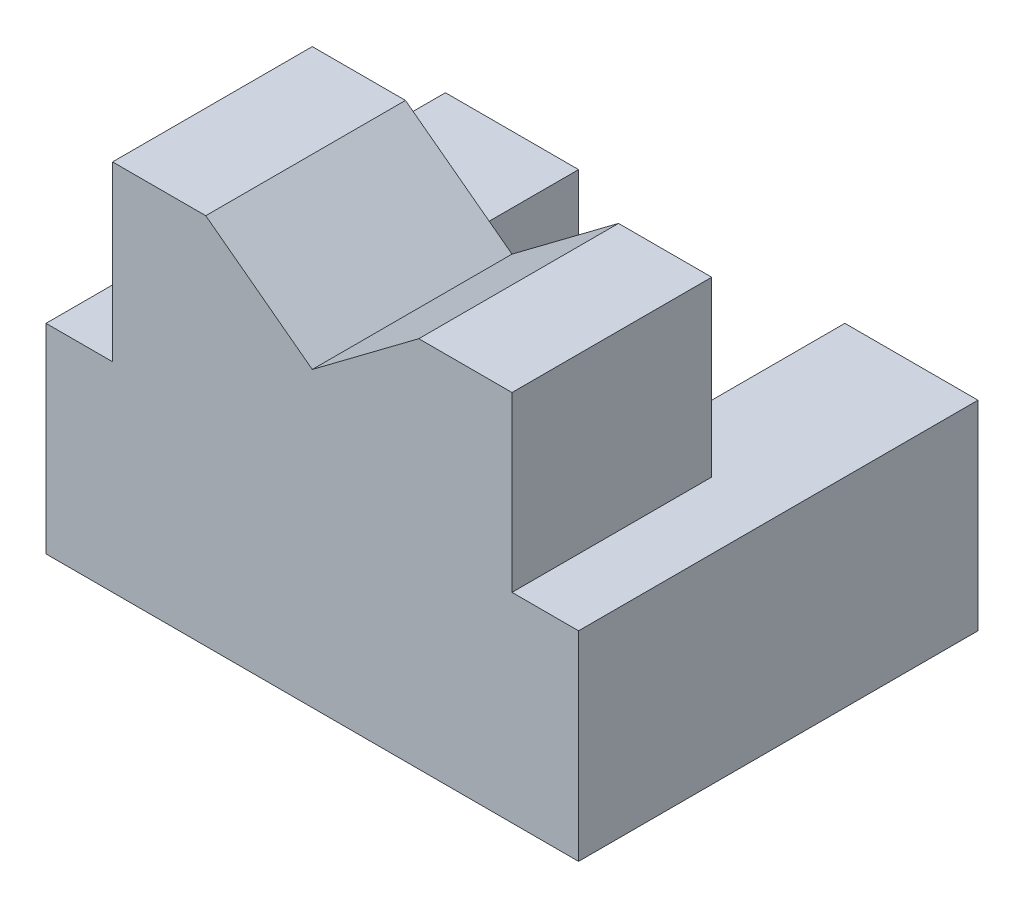
ISO-10303-21;
HEADER;
FILE_DESCRIPTION(('STEP AP214'),'2;1');
FILE_NAME('part.step','',(''),(''),'','','');
FILE_SCHEMA(('AUTOMOTIVE_DESIGN { 1 0 10303 214 1 1 1 1 }'));
ENDSEC;
DATA;
#1=APPLICATION_CONTEXT('core data for automotive mechanical design processes');
#2=APPLICATION_PROTOCOL_DEFINITION('international standard','automotive_design',2000,#1);
#3=PRODUCT_CONTEXT('',#1,'mechanical');
#4=PRODUCT('Part','Part','',(#3));
#5=PRODUCT_RELATED_PRODUCT_CATEGORY('part','',(#4));
#6=PRODUCT_DEFINITION_FORMATION('','',#4);
#7=PRODUCT_DEFINITION_CONTEXT('part definition',#1,'design');
#8=PRODUCT_DEFINITION('design','',#6,#7);
#9=PRODUCT_DEFINITION_SHAPE('','',#8);
#10=(LENGTH_UNIT() NAMED_UNIT(*) SI_UNIT(.MILLI.,.METRE.));
#11=(NAMED_UNIT(*) PLANE_ANGLE_UNIT() SI_UNIT($,.RADIAN.));
#12=(NAMED_UNIT(*) SI_UNIT($,.STERADIAN.) SOLID_ANGLE_UNIT());
#13=UNCERTAINTY_MEASURE_WITH_UNIT(LENGTH_MEASURE(1.E-05),#10,'distance_accuracy_value','');
#14=(GEOMETRIC_REPRESENTATION_CONTEXT(3) GLOBAL_UNCERTAINTY_ASSIGNED_CONTEXT((#13)) GLOBAL_UNIT_ASSIGNED_CONTEXT((#10,
#11,#12)) REPRESENTATION_CONTEXT('',''));
#15=CARTESIAN_POINT('',(0.,0.,0.));
#16=DIRECTION('',(0.,0.,1.));
#17=DIRECTION('',(1.,0.,0.));
#18=AXIS2_PLACEMENT_3D('',#15,#16,#17);
#19=CARTESIAN_POINT('',(0.,0.,-15.));
#20=DIRECTION('',(0.,0.,1.));
#21=DIRECTION('',(1.,0.,0.));
#22=AXIS2_PLACEMENT_3D('',#19,#20,#21);
#23=PLANE('',#22);
#24=DIRECTION('',(1.,0.,0.));
#25=VECTOR('',#24,1.);
#26=CARTESIAN_POINT('',(0.,-13.,-15.));
#27=LINE('',#26,#25);
#28=CARTESIAN_POINT('',(25.,-13.,-15.));
#29=VERTEX_POINT('',#28);
#30=CARTESIAN_POINT('',(30.,-13.,-15.));
#31=VERTEX_POINT('',#30);
#32=EDGE_CURVE('E59',#29,#31,#27,.T.);
#33=ORIENTED_EDGE('',*,*,#32,.F.);
#34=DIRECTION('',(0.,1.,0.));
#35=VECTOR('',#34,1.);
#36=CARTESIAN_POINT('',(25.,0.,-15.));
#37=LINE('',#36,#35);
#38=CARTESIAN_POINT('',(25.,-28.,-15.));
#39=VERTEX_POINT('',#38);
#40=EDGE_CURVE('E166',#39,#29,#37,.T.);
#41=ORIENTED_EDGE('',*,*,#40,.F.);
#42=DIRECTION('',(1.,0.,0.));
#43=VECTOR('',#42,1.);
#44=CARTESIAN_POINT('',(0.,-28.,-15.));
#45=LINE('',#44,#43);
#46=CARTESIAN_POINT('',(5.,-28.,-15.));
#47=VERTEX_POINT('',#46);
#48=EDGE_CURVE('E277',#47,#39,#45,.T.);
#49=ORIENTED_EDGE('',*,*,#48,.F.);
#50=DIRECTION('',(0.,1.,0.));
#51=VECTOR('',#50,1.);
#52=CARTESIAN_POINT('',(5.,0.,-15.));
#53=LINE('',#52,#51);
#54=CARTESIAN_POINT('',(5.,-13.,-15.));
#55=VERTEX_POINT('',#54);
#56=EDGE_CURVE('E228',#47,#55,#53,.T.);
#57=ORIENTED_EDGE('',*,*,#56,.T.);
#58=DIRECTION('',(-1.,0.,0.));
#59=VECTOR('',#58,1.);
#60=CARTESIAN_POINT('',(0.,-13.,-15.));
#61=LINE('',#60,#59);
#62=CARTESIAN_POINT('',(0.,-13.,-15.));
#63=VERTEX_POINT('',#62);
#64=EDGE_CURVE('E243',#55,#63,#61,.T.);
#65=ORIENTED_EDGE('',*,*,#64,.T.);
#66=DIRECTION('',(0.,-1.,0.));
#67=VECTOR('',#66,1.);
#68=CARTESIAN_POINT('',(0.,0.,-15.));
#69=LINE('',#68,#67);
#70=CARTESIAN_POINT('',(0.,0.,-15.));
#71=VERTEX_POINT('',#70);
#72=EDGE_CURVE('E273',#71,#63,#69,.T.);
#73=ORIENTED_EDGE('',*,*,#72,.F.);
#74=DIRECTION('',(1.,0.,0.));
#75=VECTOR('',#74,1.);
#76=CARTESIAN_POINT('',(0.,0.,-15.));
#77=LINE('',#76,#75);
#78=CARTESIAN_POINT('',(7.,0.,-15.));
#79=VERTEX_POINT('',#78);
#80=EDGE_CURVE('E286',#71,#79,#77,.T.);
#81=ORIENTED_EDGE('',*,*,#80,.T.);
#82=DIRECTION('',(-0.8,0.6,0.));
#83=VECTOR('',#82,1.);
#84=CARTESIAN_POINT('',(15.,-6.,-15.));
#85=LINE('',#84,#83);
#86=CARTESIAN_POINT('',(15.,-6.,-15.));
#87=VERTEX_POINT('',#86);
#88=EDGE_CURVE('E248',#87,#79,#85,.T.);
#89=ORIENTED_EDGE('',*,*,#88,.F.);
#90=DIRECTION('',(-0.8,-0.6,0.));
#91=VECTOR('',#90,1.);
#92=CARTESIAN_POINT('',(23.,0.,-15.));
#93=LINE('',#92,#91);
#94=CARTESIAN_POINT('',(23.,0.,-15.));
#95=VERTEX_POINT('',#94);
#96=EDGE_CURVE('E251',#95,#87,#93,.T.);
#97=ORIENTED_EDGE('',*,*,#96,.F.);
#98=CARTESIAN_POINT('',(30.,0.,-15.));
#99=VERTEX_POINT('',#98);
#100=EDGE_CURVE('E285',#95,#99,#77,.T.);
#101=ORIENTED_EDGE('',*,*,#100,.T.);
#102=DIRECTION('',(0.,-1.,0.));
#103=VECTOR('',#102,1.);
#104=CARTESIAN_POINT('',(30.,0.,-15.));
#105=LINE('',#104,#103);
#106=EDGE_CURVE('E282',#99,#31,#105,.T.);
#107=ORIENTED_EDGE('',*,*,#106,.T.);
#108=EDGE_LOOP('',(#33,#41,#49,#57,#65,#73,#81,#89,#97,#101,#107));
#109=FACE_BOUND('',#108,.T.);
#110=ADVANCED_FACE('F43',(#109),#23,.F.);
#111=CARTESIAN_POINT('',(30.,0.,-15.));
#112=DIRECTION('',(-1.,0.,0.));
#113=DIRECTION('',(0.,-1.,0.));
#114=AXIS2_PLACEMENT_3D('',#111,#112,#113);
#115=PLANE('',#114);
#116=DIRECTION('',(0.,0.,1.));
#117=VECTOR('',#116,1.);
#118=CARTESIAN_POINT('',(30.,-13.,-15.));
#119=LINE('',#118,#117);
#120=CARTESIAN_POINT('',(30.,-13.,0.));
#121=VERTEX_POINT('',#120);
#122=EDGE_CURVE('E11',#31,#121,#119,.T.);
#123=ORIENTED_EDGE('',*,*,#122,.F.);
#124=ORIENTED_EDGE('',*,*,#106,.F.);
#125=DIRECTION('',(0.,0.,1.));
#126=VECTOR('',#125,1.);
#127=CARTESIAN_POINT('',(30.,0.,-15.));
#128=LINE('',#127,#126);
#129=CARTESIAN_POINT('',(30.,0.,0.));
#130=VERTEX_POINT('',#129);
#131=EDGE_CURVE('E290',#99,#130,#128,.T.);
#132=ORIENTED_EDGE('',*,*,#131,.T.);
#133=DIRECTION('',(0.,-1.,0.));
#134=VECTOR('',#133,1.);
#135=CARTESIAN_POINT('',(30.,0.,0.));
#136=LINE('',#135,#134);
#137=EDGE_CURVE('E297',#130,#121,#136,.T.);
#138=ORIENTED_EDGE('',*,*,#137,.T.);
#139=EDGE_LOOP('',(#123,#124,#132,#138));
#140=FACE_BOUND('',#139,.T.);
#141=ADVANCED_FACE('F340',(#140),#115,.F.);
#142=CARTESIAN_POINT('',(0.,0.,-15.));
#143=DIRECTION('',(0.,-1.,0.));
#144=DIRECTION('',(0.,0.,-1.));
#145=AXIS2_PLACEMENT_3D('',#142,#143,#144);
#146=PLANE('',#145);
#147=DIRECTION('',(0.,0.,1.));
#148=VECTOR('',#147,1.);
#149=CARTESIAN_POINT('',(7.,0.,-15.));
#150=LINE('',#149,#148);
#151=CARTESIAN_POINT('',(7.,0.,0.));
#152=VERTEX_POINT('',#151);
#153=EDGE_CURVE('E269',#79,#152,#150,.T.);
#154=ORIENTED_EDGE('',*,*,#153,.F.);
#155=ORIENTED_EDGE('',*,*,#80,.F.);
#156=DIRECTION('',(0.,0.,1.));
#157=VECTOR('',#156,1.);
#158=CARTESIAN_POINT('',(0.,0.,-15.));
#159=LINE('',#158,#157);
#160=CARTESIAN_POINT('',(0.,0.,0.));
#161=VERTEX_POINT('',#160);
#162=EDGE_CURVE('E304',#71,#161,#159,.T.);
#163=ORIENTED_EDGE('',*,*,#162,.T.);
#164=DIRECTION('',(1.,0.,0.));
#165=VECTOR('',#164,1.);
#166=CARTESIAN_POINT('',(0.,0.,0.));
#167=LINE('',#166,#165);
#168=EDGE_CURVE('E278',#161,#152,#167,.T.);
#169=ORIENTED_EDGE('',*,*,#168,.T.);
#170=EDGE_LOOP('',(#154,#155,#163,#169));
#171=FACE_BOUND('',#170,.T.);
#172=ADVANCED_FACE('F321',(#171),#146,.F.);
#173=DIRECTION('',(0.,0.,1.));
#174=VECTOR('',#173,1.);
#175=CARTESIAN_POINT('',(23.,0.,-15.));
#176=LINE('',#175,#174);
#177=CARTESIAN_POINT('',(23.,0.,0.));
#178=VERTEX_POINT('',#177);
#179=EDGE_CURVE('E265',#95,#178,#176,.T.);
#180=ORIENTED_EDGE('',*,*,#179,.T.);
#181=EDGE_CURVE('E300',#178,#130,#167,.T.);
#182=ORIENTED_EDGE('',*,*,#181,.T.);
#183=ORIENTED_EDGE('',*,*,#131,.F.);
#184=ORIENTED_EDGE('',*,*,#100,.F.);
#185=EDGE_LOOP('',(#180,#182,#183,#184));
#186=FACE_BOUND('',#185,.T.);
#187=ADVANCED_FACE('F339',(#186),#146,.F.);
#188=CARTESIAN_POINT('',(0.,0.,0.));
#189=DIRECTION('',(0.,0.,1.));
#190=DIRECTION('',(1.,0.,0.));
#191=AXIS2_PLACEMENT_3D('',#188,#189,#190);
#192=PLANE('',#191);
#193=DIRECTION('',(1.,0.,0.));
#194=VECTOR('',#193,1.);
#195=CARTESIAN_POINT('',(0.,-13.,0.));
#196=LINE('',#195,#194);
#197=CARTESIAN_POINT('',(35.,-13.,0.));
#198=VERTEX_POINT('',#197);
#199=EDGE_CURVE('E181',#121,#198,#196,.T.);
#200=ORIENTED_EDGE('',*,*,#199,.F.);
#201=ORIENTED_EDGE('',*,*,#137,.F.);
#202=ORIENTED_EDGE('',*,*,#181,.F.);
#203=DIRECTION('',(-0.8,-0.6,0.));
#204=VECTOR('',#203,1.);
#205=CARTESIAN_POINT('',(23.,0.,0.));
#206=LINE('',#205,#204);
#207=CARTESIAN_POINT('',(15.,-6.,0.));
#208=VERTEX_POINT('',#207);
#209=EDGE_CURVE('E252',#178,#208,#206,.T.);
#210=ORIENTED_EDGE('',*,*,#209,.T.);
#211=DIRECTION('',(-0.8,0.6,0.));
#212=VECTOR('',#211,1.);
#213=CARTESIAN_POINT('',(15.,-6.,0.));
#214=LINE('',#213,#212);
#215=EDGE_CURVE('E247',#208,#152,#214,.T.);
#216=ORIENTED_EDGE('',*,*,#215,.T.);
#217=ORIENTED_EDGE('',*,*,#168,.F.);
#218=DIRECTION('',(0.,-1.,0.));
#219=VECTOR('',#218,1.);
#220=CARTESIAN_POINT('',(0.,0.,0.));
#221=LINE('',#220,#219);
#222=CARTESIAN_POINT('',(0.,-13.,0.));
#223=VERTEX_POINT('',#222);
#224=EDGE_CURVE('E272',#161,#223,#221,.T.);
#225=ORIENTED_EDGE('',*,*,#224,.T.);
#226=DIRECTION('',(-1.,0.,0.));
#227=VECTOR('',#226,1.);
#228=CARTESIAN_POINT('',(0.,-13.,0.));
#229=LINE('',#228,#227);
#230=CARTESIAN_POINT('',(-5.,-13.,0.));
#231=VERTEX_POINT('',#230);
#232=EDGE_CURVE('E207',#223,#231,#229,.T.);
#233=ORIENTED_EDGE('',*,*,#232,.T.);
#234=DIRECTION('',(0.,1.,0.));
#235=VECTOR('',#234,1.);
#236=CARTESIAN_POINT('',(-5.,0.,0.));
#237=LINE('',#236,#235);
#238=CARTESIAN_POINT('',(-5.,-28.,0.));
#239=VERTEX_POINT('',#238);
#240=EDGE_CURVE('E202',#239,#231,#237,.T.);
#241=ORIENTED_EDGE('',*,*,#240,.F.);
#242=DIRECTION('',(1.,0.,0.));
#243=VECTOR('',#242,1.);
#244=CARTESIAN_POINT('',(0.,-28.,0.));
#245=LINE('',#244,#243);
#246=CARTESIAN_POINT('',(35.,-28.,0.));
#247=VERTEX_POINT('',#246);
#248=EDGE_CURVE('E294',#239,#247,#245,.T.);
#249=ORIENTED_EDGE('',*,*,#248,.T.);
#250=DIRECTION('',(0.,1.,0.));
#251=VECTOR('',#250,1.);
#252=CARTESIAN_POINT('',(35.,0.,0.));
#253=LINE('',#252,#251);
#254=EDGE_CURVE('E177',#247,#198,#253,.T.);
#255=ORIENTED_EDGE('',*,*,#254,.T.);
#256=EDGE_LOOP('',(#200,#201,#202,#210,#216,#217,#225,#233,#241,#249,#255));
#257=FACE_BOUND('',#256,.T.);
#258=ADVANCED_FACE('F333',(#257),#192,.T.);
#259=CARTESIAN_POINT('',(0.,0.,-15.));
#260=DIRECTION('',(-1.,0.,0.));
#261=DIRECTION('',(0.,-1.,0.));
#262=AXIS2_PLACEMENT_3D('',#259,#260,#261);
#263=PLANE('',#262);
#264=DIRECTION('',(0.,0.,-1.));
#265=VECTOR('',#264,1.);
#266=CARTESIAN_POINT('',(0.,-13.,-15.));
#267=LINE('',#266,#265);
#268=EDGE_CURVE('E52',#223,#63,#267,.T.);
#269=ORIENTED_EDGE('',*,*,#268,.F.);
#270=ORIENTED_EDGE('',*,*,#224,.F.);
#271=ORIENTED_EDGE('',*,*,#162,.F.);
#272=ORIENTED_EDGE('',*,*,#72,.T.);
#273=EDGE_LOOP('',(#269,#270,#271,#272));
#274=FACE_BOUND('',#273,.T.);
#275=ADVANCED_FACE('F45',(#274),#263,.T.);
#276=CARTESIAN_POINT('',(0.,-28.,-15.));
#277=DIRECTION('',(0.,-1.,0.));
#278=DIRECTION('',(0.,0.,-1.));
#279=AXIS2_PLACEMENT_3D('',#276,#277,#278);
#280=PLANE('',#279);
#281=DIRECTION('',(0.,0.,1.));
#282=VECTOR('',#281,1.);
#283=CARTESIAN_POINT('',(35.,-28.,-30.));
#284=LINE('',#283,#282);
#285=CARTESIAN_POINT('',(35.,-28.,-30.));
#286=VERTEX_POINT('',#285);
#287=EDGE_CURVE('E192',#286,#247,#284,.T.);
#288=ORIENTED_EDGE('',*,*,#287,.T.);
#289=ORIENTED_EDGE('',*,*,#248,.F.);
#290=DIRECTION('',(0.,0.,1.));
#291=VECTOR('',#290,1.);
#292=CARTESIAN_POINT('',(-5.,-28.,-30.));
#293=LINE('',#292,#291);
#294=CARTESIAN_POINT('',(-5.,-28.,-30.));
#295=VERTEX_POINT('',#294);
#296=EDGE_CURVE('E218',#295,#239,#293,.T.);
#297=ORIENTED_EDGE('',*,*,#296,.F.);
#298=DIRECTION('',(-1.,0.,0.));
#299=VECTOR('',#298,1.);
#300=CARTESIAN_POINT('',(0.,-28.,-30.));
#301=LINE('',#300,#299);
#302=CARTESIAN_POINT('',(5.,-28.,-30.));
#303=VERTEX_POINT('',#302);
#304=EDGE_CURVE('E206',#303,#295,#301,.T.);
#305=ORIENTED_EDGE('',*,*,#304,.F.);
#306=DIRECTION('',(0.,0.,1.));
#307=VECTOR('',#306,1.);
#308=CARTESIAN_POINT('',(5.,-28.,-30.));
#309=LINE('',#308,#307);
#310=EDGE_CURVE('E233',#303,#47,#309,.T.);
#311=ORIENTED_EDGE('',*,*,#310,.T.);
#312=ORIENTED_EDGE('',*,*,#48,.T.);
#313=DIRECTION('',(0.,0.,1.));
#314=VECTOR('',#313,1.);
#315=CARTESIAN_POINT('',(25.,-28.,-30.));
#316=LINE('',#315,#314);
#317=CARTESIAN_POINT('',(25.,-28.,-30.));
#318=VERTEX_POINT('',#317);
#319=EDGE_CURVE('E169',#318,#39,#316,.T.);
#320=ORIENTED_EDGE('',*,*,#319,.F.);
#321=DIRECTION('',(1.,0.,0.));
#322=VECTOR('',#321,1.);
#323=CARTESIAN_POINT('',(0.,-28.,-30.));
#324=LINE('',#323,#322);
#325=EDGE_CURVE('E158',#318,#286,#324,.T.);
#326=ORIENTED_EDGE('',*,*,#325,.T.);
#327=EDGE_LOOP('',(#288,#289,#297,#305,#311,#312,#320,#326));
#328=FACE_BOUND('',#327,.T.);
#329=ADVANCED_FACE('F350',(#328),#280,.T.);
#330=CARTESIAN_POINT('',(15.,-6.,-15.));
#331=DIRECTION('',(0.6,0.8,0.));
#332=DIRECTION('',(-0.8,0.6,0.));
#333=AXIS2_PLACEMENT_3D('',#330,#331,#332);
#334=PLANE('',#333);
#335=ORIENTED_EDGE('',*,*,#215,.F.);
#336=DIRECTION('',(0.,0.,1.));
#337=VECTOR('',#336,1.);
#338=CARTESIAN_POINT('',(15.,-6.,-15.));
#339=LINE('',#338,#337);
#340=EDGE_CURVE('E255',#87,#208,#339,.T.);
#341=ORIENTED_EDGE('',*,*,#340,.F.);
#342=ORIENTED_EDGE('',*,*,#88,.T.);
#343=ORIENTED_EDGE('',*,*,#153,.T.);
#344=EDGE_LOOP('',(#335,#341,#342,#343));
#345=FACE_BOUND('',#344,.T.);
#346=ADVANCED_FACE('F327',(#345),#334,.T.);
#347=CARTESIAN_POINT('',(23.,0.,-15.));
#348=DIRECTION('',(-0.6,0.8,0.));
#349=DIRECTION('',(-0.8,-0.6,0.));
#350=AXIS2_PLACEMENT_3D('',#347,#348,#349);
#351=PLANE('',#350);
#352=ORIENTED_EDGE('',*,*,#209,.F.);
#353=ORIENTED_EDGE('',*,*,#179,.F.);
#354=ORIENTED_EDGE('',*,*,#96,.T.);
#355=ORIENTED_EDGE('',*,*,#340,.T.);
#356=EDGE_LOOP('',(#352,#353,#354,#355));
#357=FACE_BOUND('',#356,.T.);
#358=ADVANCED_FACE('F329',(#357),#351,.T.);
#359=CARTESIAN_POINT('',(0.,-13.,-30.));
#360=DIRECTION('',(0.,1.,0.));
#361=DIRECTION('',(0.,0.,1.));
#362=AXIS2_PLACEMENT_3D('',#359,#360,#361);
#363=PLANE('',#362);
#364=ORIENTED_EDGE('',*,*,#64,.F.);
#365=DIRECTION('',(0.,0.,1.));
#366=VECTOR('',#365,1.);
#367=CARTESIAN_POINT('',(5.,-13.,-30.));
#368=LINE('',#367,#366);
#369=CARTESIAN_POINT('',(5.,-13.,-30.));
#370=VERTEX_POINT('',#369);
#371=EDGE_CURVE('E229',#370,#55,#368,.T.);
#372=ORIENTED_EDGE('',*,*,#371,.F.);
#373=DIRECTION('',(-1.,0.,0.));
#374=VECTOR('',#373,1.);
#375=CARTESIAN_POINT('',(0.,-13.,-30.));
#376=LINE('',#375,#374);
#377=CARTESIAN_POINT('',(-5.,-13.,-30.));
#378=VERTEX_POINT('',#377);
#379=EDGE_CURVE('E214',#370,#378,#376,.T.);
#380=ORIENTED_EDGE('',*,*,#379,.T.);
#381=DIRECTION('',(0.,0.,1.));
#382=VECTOR('',#381,1.);
#383=CARTESIAN_POINT('',(-5.,-13.,-30.));
#384=LINE('',#383,#382);
#385=EDGE_CURVE('E224',#378,#231,#384,.T.);
#386=ORIENTED_EDGE('',*,*,#385,.T.);
#387=ORIENTED_EDGE('',*,*,#232,.F.);
#388=ORIENTED_EDGE('',*,*,#268,.T.);
#389=EDGE_LOOP('',(#364,#372,#380,#386,#387,#388));
#390=FACE_BOUND('',#389,.T.);
#391=ADVANCED_FACE('F312',(#390),#363,.T.);
#392=CARTESIAN_POINT('',(5.,0.,-30.));
#393=DIRECTION('',(1.,0.,0.));
#394=DIRECTION('',(0.,0.,-1.));
#395=AXIS2_PLACEMENT_3D('',#392,#393,#394);
#396=PLANE('',#395);
#397=ORIENTED_EDGE('',*,*,#56,.F.);
#398=ORIENTED_EDGE('',*,*,#310,.F.);
#399=DIRECTION('',(0.,1.,0.));
#400=VECTOR('',#399,1.);
#401=CARTESIAN_POINT('',(5.,0.,-30.));
#402=LINE('',#401,#400);
#403=EDGE_CURVE('E210',#303,#370,#402,.T.);
#404=ORIENTED_EDGE('',*,*,#403,.T.);
#405=ORIENTED_EDGE('',*,*,#371,.T.);
#406=EDGE_LOOP('',(#397,#398,#404,#405));
#407=FACE_BOUND('',#406,.T.);
#408=ADVANCED_FACE('F373',(#407),#396,.T.);
#409=CARTESIAN_POINT('',(-5.,0.,-30.));
#410=DIRECTION('',(1.,0.,0.));
#411=DIRECTION('',(0.,0.,-1.));
#412=AXIS2_PLACEMENT_3D('',#409,#410,#411);
#413=PLANE('',#412);
#414=ORIENTED_EDGE('',*,*,#240,.T.);
#415=ORIENTED_EDGE('',*,*,#385,.F.);
#416=DIRECTION('',(0.,1.,0.));
#417=VECTOR('',#416,1.);
#418=CARTESIAN_POINT('',(-5.,0.,-30.));
#419=LINE('',#418,#417);
#420=EDGE_CURVE('E203',#295,#378,#419,.T.);
#421=ORIENTED_EDGE('',*,*,#420,.F.);
#422=ORIENTED_EDGE('',*,*,#296,.T.);
#423=EDGE_LOOP('',(#414,#415,#421,#422));
#424=FACE_BOUND('',#423,.T.);
#425=ADVANCED_FACE('F365',(#424),#413,.F.);
#426=CARTESIAN_POINT('',(0.,0.,-30.));
#427=DIRECTION('',(0.,0.,1.));
#428=DIRECTION('',(1.,0.,0.));
#429=AXIS2_PLACEMENT_3D('',#426,#427,#428);
#430=PLANE('',#429);
#431=ORIENTED_EDGE('',*,*,#420,.T.);
#432=ORIENTED_EDGE('',*,*,#379,.F.);
#433=ORIENTED_EDGE('',*,*,#403,.F.);
#434=ORIENTED_EDGE('',*,*,#304,.T.);
#435=EDGE_LOOP('',(#431,#432,#433,#434));
#436=FACE_BOUND('',#435,.T.);
#437=ADVANCED_FACE('F371',(#436),#430,.F.);
#438=CARTESIAN_POINT('',(0.,-13.,-30.));
#439=DIRECTION('',(0.,-1.,0.));
#440=DIRECTION('',(0.,0.,-1.));
#441=AXIS2_PLACEMENT_3D('',#438,#439,#440);
#442=PLANE('',#441);
#443=DIRECTION('',(0.,0.,1.));
#444=VECTOR('',#443,1.);
#445=CARTESIAN_POINT('',(25.,-13.,-30.));
#446=LINE('',#445,#444);
#447=CARTESIAN_POINT('',(25.,-13.,-30.));
#448=VERTEX_POINT('',#447);
#449=EDGE_CURVE('E164',#448,#29,#446,.T.);
#450=ORIENTED_EDGE('',*,*,#449,.T.);
#451=ORIENTED_EDGE('',*,*,#32,.T.);
#452=ORIENTED_EDGE('',*,*,#122,.T.);
#453=ORIENTED_EDGE('',*,*,#199,.T.);
#454=DIRECTION('',(0.,0.,1.));
#455=VECTOR('',#454,1.);
#456=CARTESIAN_POINT('',(35.,-13.,-30.));
#457=LINE('',#456,#455);
#458=CARTESIAN_POINT('',(35.,-13.,-30.));
#459=VERTEX_POINT('',#458);
#460=EDGE_CURVE('E174',#459,#198,#457,.T.);
#461=ORIENTED_EDGE('',*,*,#460,.F.);
#462=DIRECTION('',(1.,0.,0.));
#463=VECTOR('',#462,1.);
#464=CARTESIAN_POINT('',(0.,-13.,-30.));
#465=LINE('',#464,#463);
#466=EDGE_CURVE('E155',#448,#459,#465,.T.);
#467=ORIENTED_EDGE('',*,*,#466,.F.);
#468=EDGE_LOOP('',(#450,#451,#452,#453,#461,#467));
#469=FACE_BOUND('',#468,.T.);
#470=ADVANCED_FACE('F172',(#469),#442,.F.);
#471=CARTESIAN_POINT('',(25.,0.,-30.));
#472=DIRECTION('',(1.,0.,0.));
#473=DIRECTION('',(0.,0.,-1.));
#474=AXIS2_PLACEMENT_3D('',#471,#472,#473);
#475=PLANE('',#474);
#476=ORIENTED_EDGE('',*,*,#319,.T.);
#477=ORIENTED_EDGE('',*,*,#40,.T.);
#478=ORIENTED_EDGE('',*,*,#449,.F.);
#479=DIRECTION('',(0.,1.,0.));
#480=VECTOR('',#479,1.);
#481=CARTESIAN_POINT('',(25.,0.,-30.));
#482=LINE('',#481,#480);
#483=EDGE_CURVE('E150',#318,#448,#482,.T.);
#484=ORIENTED_EDGE('',*,*,#483,.F.);
#485=EDGE_LOOP('',(#476,#477,#478,#484));
#486=FACE_BOUND('',#485,.T.);
#487=ADVANCED_FACE('F165',(#486),#475,.F.);
#488=CARTESIAN_POINT('',(35.,0.,-30.));
#489=DIRECTION('',(1.,0.,0.));
#490=DIRECTION('',(0.,0.,-1.));
#491=AXIS2_PLACEMENT_3D('',#488,#489,#490);
#492=PLANE('',#491);
#493=ORIENTED_EDGE('',*,*,#254,.F.);
#494=ORIENTED_EDGE('',*,*,#287,.F.);
#495=DIRECTION('',(0.,1.,0.));
#496=VECTOR('',#495,1.);
#497=CARTESIAN_POINT('',(35.,0.,-30.));
#498=LINE('',#497,#496);
#499=EDGE_CURVE('E170',#286,#459,#498,.T.);
#500=ORIENTED_EDGE('',*,*,#499,.T.);
#501=ORIENTED_EDGE('',*,*,#460,.T.);
#502=EDGE_LOOP('',(#493,#494,#500,#501));
#503=FACE_BOUND('',#502,.T.);
#504=ADVANCED_FACE('F361',(#503),#492,.T.);
#505=CARTESIAN_POINT('',(0.,0.,-30.));
#506=DIRECTION('',(0.,0.,1.));
#507=DIRECTION('',(1.,0.,0.));
#508=AXIS2_PLACEMENT_3D('',#505,#506,#507);
#509=PLANE('',#508);
#510=ORIENTED_EDGE('',*,*,#466,.T.);
#511=ORIENTED_EDGE('',*,*,#499,.F.);
#512=ORIENTED_EDGE('',*,*,#325,.F.);
#513=ORIENTED_EDGE('',*,*,#483,.T.);
#514=EDGE_LOOP('',(#510,#511,#512,#513));
#515=FACE_BOUND('',#514,.T.);
#516=ADVANCED_FACE('F152',(#515),#509,.F.);
#517=CLOSED_SHELL('',(#110,#141,#172,#187,#258,#275,#329,#346,#358,#391,#408,#425,#437,#470,
#487,#504,#516));
#518=MANIFOLD_SOLID_BREP('B2',#517);
#519=ADVANCED_BREP_SHAPE_REPRESENTATION('',(#18,#518),#14);
#520=SHAPE_DEFINITION_REPRESENTATION(#9,#519);
ENDSEC;
END-ISO-10303-21;
